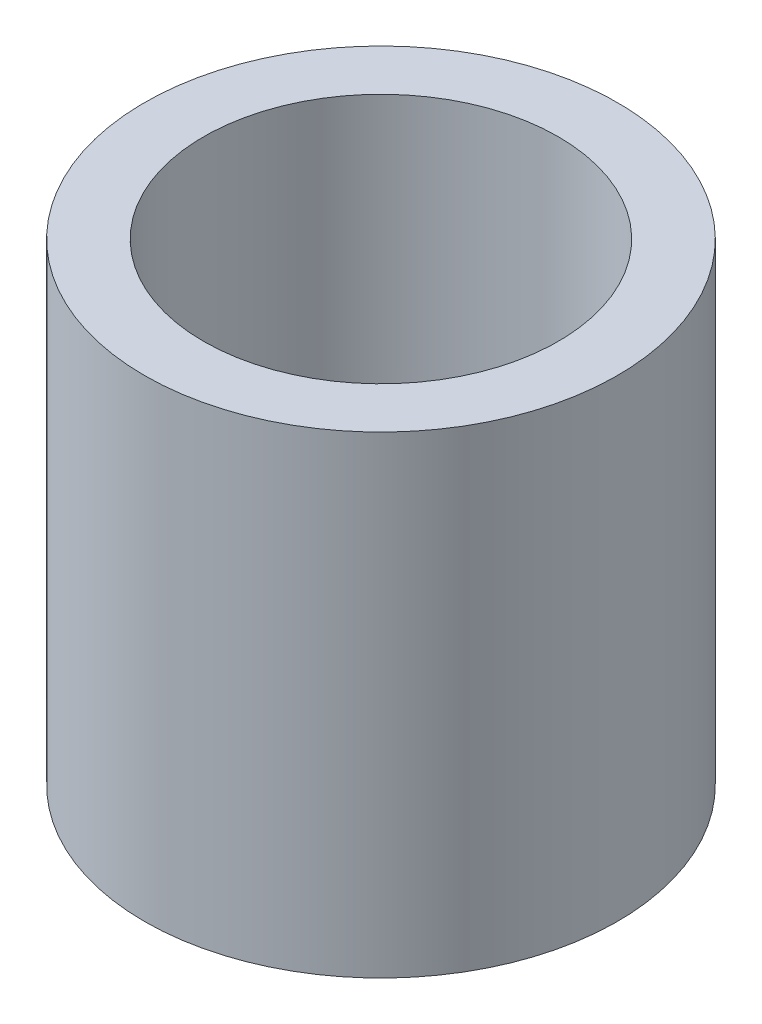
ISO-10303-21;
HEADER;
FILE_DESCRIPTION(('STEP AP214'),'2;1');
FILE_NAME('part.step','',(''),(''),'','','');
FILE_SCHEMA(('AUTOMOTIVE_DESIGN { 1 0 10303 214 1 1 1 1 }'));
ENDSEC;
DATA;
#1=APPLICATION_CONTEXT('core data for automotive mechanical design processes');
#2=APPLICATION_PROTOCOL_DEFINITION('international standard','automotive_design',2000,#1);
#3=PRODUCT_CONTEXT('',#1,'mechanical');
#4=PRODUCT('Part','Part','',(#3));
#5=PRODUCT_RELATED_PRODUCT_CATEGORY('part','',(#4));
#6=PRODUCT_DEFINITION_FORMATION('','',#4);
#7=PRODUCT_DEFINITION_CONTEXT('part definition',#1,'design');
#8=PRODUCT_DEFINITION('design','',#6,#7);
#9=PRODUCT_DEFINITION_SHAPE('','',#8);
#10=(LENGTH_UNIT() NAMED_UNIT(*) SI_UNIT(.MILLI.,.METRE.));
#11=(NAMED_UNIT(*) PLANE_ANGLE_UNIT() SI_UNIT($,.RADIAN.));
#12=(NAMED_UNIT(*) SI_UNIT($,.STERADIAN.) SOLID_ANGLE_UNIT());
#13=UNCERTAINTY_MEASURE_WITH_UNIT(LENGTH_MEASURE(1.E-05),#10,'distance_accuracy_value','');
#14=(GEOMETRIC_REPRESENTATION_CONTEXT(3) GLOBAL_UNCERTAINTY_ASSIGNED_CONTEXT((#13)) GLOBAL_UNIT_ASSIGNED_CONTEXT((#10,
#11,#12)) REPRESENTATION_CONTEXT('',''));
#15=CARTESIAN_POINT('',(0.,0.,0.));
#16=DIRECTION('',(0.,0.,1.));
#17=DIRECTION('',(1.,0.,0.));
#18=AXIS2_PLACEMENT_3D('',#15,#16,#17);
#19=CARTESIAN_POINT('',(0.,16.,0.));
#20=DIRECTION('',(0.,1.,0.));
#21=DIRECTION('',(0.,0.,1.));
#22=AXIS2_PLACEMENT_3D('',#19,#20,#21);
#23=PLANE('',#22);
#24=CARTESIAN_POINT('',(0.,16.,0.));
#25=DIRECTION('',(0.,1.,0.));
#26=DIRECTION('',(0.,0.,1.));
#27=AXIS2_PLACEMENT_3D('',#24,#25,#26);
#28=CIRCLE('',#27,8.);
#29=CARTESIAN_POINT('',(0.,16.,8.));
#30=VERTEX_POINT('',#29);
#31=EDGE_CURVE('E10',#30,#30,#28,.T.);
#32=ORIENTED_EDGE('',*,*,#31,.T.);
#33=EDGE_LOOP('',(#32));
#34=FACE_BOUND('',#33,.T.);
#35=CARTESIAN_POINT('',(0.,16.,0.));
#36=DIRECTION('',(0.,1.,0.));
#37=DIRECTION('',(0.,0.,1.));
#38=AXIS2_PLACEMENT_3D('',#35,#36,#37);
#39=CIRCLE('',#38,6.);
#40=CARTESIAN_POINT('',(0.,16.,6.));
#41=VERTEX_POINT('',#40);
#42=EDGE_CURVE('E50',#41,#41,#39,.T.);
#43=ORIENTED_EDGE('',*,*,#42,.F.);
#44=EDGE_LOOP('',(#43));
#45=FACE_BOUND('',#44,.T.);
#46=ADVANCED_FACE('F36',(#34,#45),#23,.T.);
#47=CARTESIAN_POINT('',(0.,0.,0.));
#48=DIRECTION('',(0.,1.,0.));
#49=DIRECTION('',(0.,0.,1.));
#50=AXIS2_PLACEMENT_3D('',#47,#48,#49);
#51=PLANE('',#50);
#52=CARTESIAN_POINT('',(0.,0.,0.));
#53=DIRECTION('',(0.,1.,0.));
#54=DIRECTION('',(0.,0.,1.));
#55=AXIS2_PLACEMENT_3D('',#52,#53,#54);
#56=CIRCLE('',#55,8.);
#57=CARTESIAN_POINT('',(0.,0.,8.));
#58=VERTEX_POINT('',#57);
#59=EDGE_CURVE('E40',#58,#58,#56,.T.);
#60=ORIENTED_EDGE('',*,*,#59,.F.);
#61=EDGE_LOOP('',(#60));
#62=FACE_BOUND('',#61,.T.);
#63=CARTESIAN_POINT('',(0.,0.,0.));
#64=DIRECTION('',(0.,1.,0.));
#65=DIRECTION('',(0.,0.,1.));
#66=AXIS2_PLACEMENT_3D('',#63,#64,#65);
#67=CIRCLE('',#66,6.);
#68=CARTESIAN_POINT('',(0.,0.,6.));
#69=VERTEX_POINT('',#68);
#70=EDGE_CURVE('E52',#69,#69,#67,.T.);
#71=ORIENTED_EDGE('',*,*,#70,.T.);
#72=EDGE_LOOP('',(#71));
#73=FACE_BOUND('',#72,.T.);
#74=ADVANCED_FACE('F65',(#62,#73),#51,.F.);
#75=CARTESIAN_POINT('',(0.,16.,0.));
#76=DIRECTION('',(0.,-1.,0.));
#77=DIRECTION('',(0.,0.,-1.));
#78=AXIS2_PLACEMENT_3D('',#75,#76,#77);
#79=CYLINDRICAL_SURFACE('',#78,8.);
#80=ORIENTED_EDGE('',*,*,#31,.F.);
#81=EDGE_LOOP('',(#80));
#82=FACE_BOUND('',#81,.T.);
#83=ORIENTED_EDGE('',*,*,#59,.T.);
#84=EDGE_LOOP('',(#83));
#85=FACE_BOUND('',#84,.T.);
#86=ADVANCED_FACE('F38',(#82,#85),#79,.T.);
#87=CARTESIAN_POINT('',(0.,16.,0.));
#88=DIRECTION('',(0.,-1.,0.));
#89=DIRECTION('',(0.,0.,-1.));
#90=AXIS2_PLACEMENT_3D('',#87,#88,#89);
#91=CYLINDRICAL_SURFACE('',#90,6.);
#92=ORIENTED_EDGE('',*,*,#42,.T.);
#93=EDGE_LOOP('',(#92));
#94=FACE_BOUND('',#93,.T.);
#95=ORIENTED_EDGE('',*,*,#70,.F.);
#96=EDGE_LOOP('',(#95));
#97=FACE_BOUND('',#96,.T.);
#98=ADVANCED_FACE('F61',(#94,#97),#91,.F.);
#99=CLOSED_SHELL('',(#46,#74,#86,#98));
#100=MANIFOLD_SOLID_BREP('B2',#99);
#101=ADVANCED_BREP_SHAPE_REPRESENTATION('',(#18,#100),#14);
#102=SHAPE_DEFINITION_REPRESENTATION(#9,#101);
ENDSEC;
END-ISO-10303-21;
